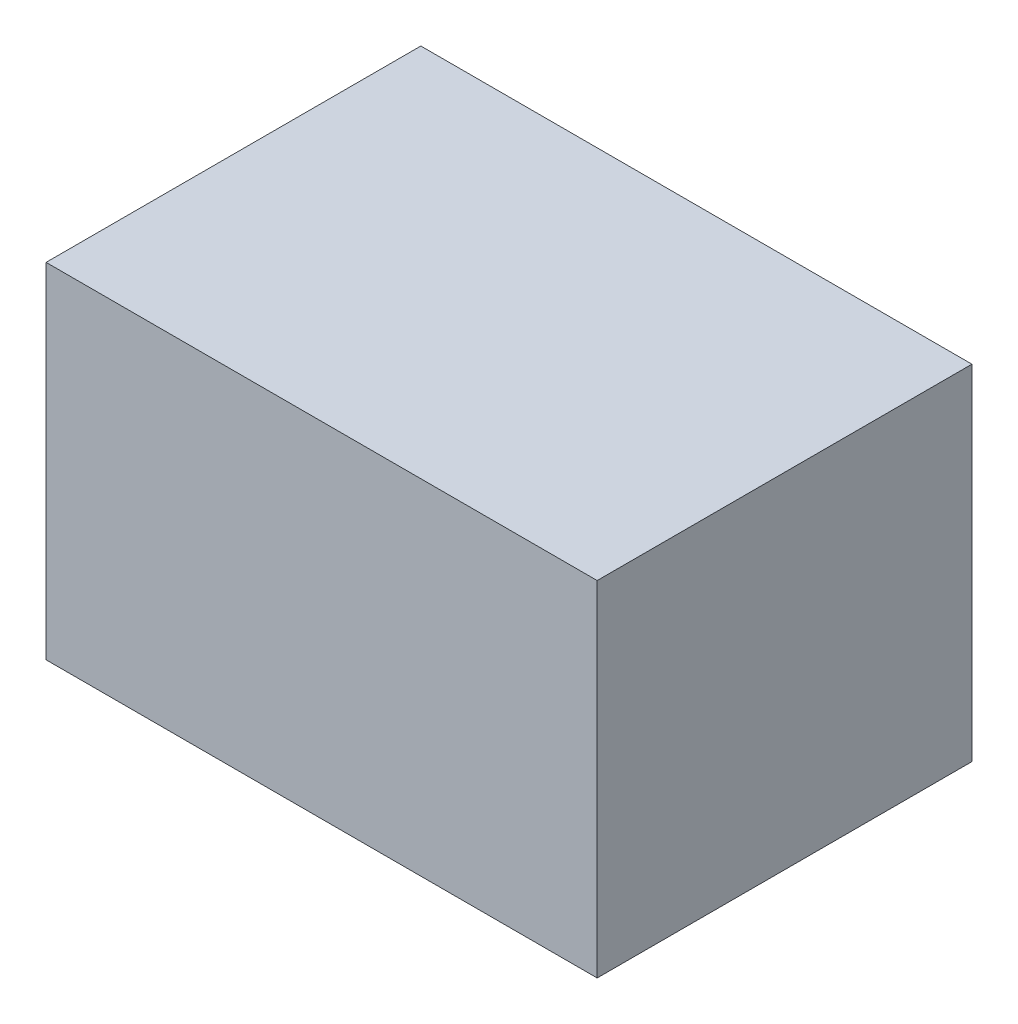
ISO-10303-21;
HEADER;
FILE_DESCRIPTION(('STEP AP214'),'2;1');
FILE_NAME('part.step','',(''),(''),'','','');
FILE_SCHEMA(('AUTOMOTIVE_DESIGN { 1 0 10303 214 1 1 1 1 }'));
ENDSEC;
DATA;
#1=APPLICATION_CONTEXT('core data for automotive mechanical design processes');
#2=APPLICATION_PROTOCOL_DEFINITION('international standard','automotive_design',2000,#1);
#3=PRODUCT_CONTEXT('',#1,'mechanical');
#4=PRODUCT('Part','Part','',(#3));
#5=PRODUCT_RELATED_PRODUCT_CATEGORY('part','',(#4));
#6=PRODUCT_DEFINITION_FORMATION('','',#4);
#7=PRODUCT_DEFINITION_CONTEXT('part definition',#1,'design');
#8=PRODUCT_DEFINITION('design','',#6,#7);
#9=PRODUCT_DEFINITION_SHAPE('','',#8);
#10=(LENGTH_UNIT() NAMED_UNIT(*) SI_UNIT(.MILLI.,.METRE.));
#11=(NAMED_UNIT(*) PLANE_ANGLE_UNIT() SI_UNIT($,.RADIAN.));
#12=(NAMED_UNIT(*) SI_UNIT($,.STERADIAN.) SOLID_ANGLE_UNIT());
#13=UNCERTAINTY_MEASURE_WITH_UNIT(LENGTH_MEASURE(1.E-05),#10,'distance_accuracy_value','');
#14=(GEOMETRIC_REPRESENTATION_CONTEXT(3) GLOBAL_UNCERTAINTY_ASSIGNED_CONTEXT((#13)) GLOBAL_UNIT_ASSIGNED_CONTEXT((#10,
#11,#12)) REPRESENTATION_CONTEXT('',''));
#15=CARTESIAN_POINT('',(0.,0.,0.));
#16=DIRECTION('',(0.,0.,1.));
#17=DIRECTION('',(1.,0.,0.));
#18=AXIS2_PLACEMENT_3D('',#15,#16,#17);
#19=CARTESIAN_POINT('',(0.,0.,561.34));
#20=DIRECTION('',(1.,0.,0.));
#21=DIRECTION('',(0.,0.,-1.));
#22=AXIS2_PLACEMENT_3D('',#19,#20,#21);
#23=PLANE('',#22);
#24=DIRECTION('',(0.,-1.,0.));
#25=VECTOR('',#24,1.);
#26=CARTESIAN_POINT('',(0.,0.,0.));
#27=LINE('',#26,#25);
#28=CARTESIAN_POINT('',(0.,515.62,0.));
#29=VERTEX_POINT('',#28);
#30=CARTESIAN_POINT('',(0.,0.,0.));
#31=VERTEX_POINT('',#30);
#32=EDGE_CURVE('E163',#29,#31,#27,.T.);
#33=ORIENTED_EDGE('',*,*,#32,.T.);
#34=DIRECTION('',(0.,0.,-1.));
#35=VECTOR('',#34,1.);
#36=CARTESIAN_POINT('',(0.,0.,561.34));
#37=LINE('',#36,#35);
#38=CARTESIAN_POINT('',(0.,0.,561.34));
#39=VERTEX_POINT('',#38);
#40=EDGE_CURVE('E11',#39,#31,#37,.T.);
#41=ORIENTED_EDGE('',*,*,#40,.F.);
#42=DIRECTION('',(0.,-1.,0.));
#43=VECTOR('',#42,1.);
#44=CARTESIAN_POINT('',(0.,0.,561.34));
#45=LINE('',#44,#43);
#46=CARTESIAN_POINT('',(0.,515.62,561.34));
#47=VERTEX_POINT('',#46);
#48=EDGE_CURVE('E169',#47,#39,#45,.T.);
#49=ORIENTED_EDGE('',*,*,#48,.F.);
#50=DIRECTION('',(0.,0.,-1.));
#51=VECTOR('',#50,1.);
#52=CARTESIAN_POINT('',(0.,515.62,561.34));
#53=LINE('',#52,#51);
#54=EDGE_CURVE('E179',#47,#29,#53,.T.);
#55=ORIENTED_EDGE('',*,*,#54,.T.);
#56=EDGE_LOOP('',(#33,#41,#49,#55));
#57=FACE_BOUND('',#56,.T.);
#58=ADVANCED_FACE('F44',(#57),#23,.F.);
#59=CARTESIAN_POINT('',(0.,0.,561.34));
#60=DIRECTION('',(0.,1.,0.));
#61=DIRECTION('',(0.,0.,1.));
#62=AXIS2_PLACEMENT_3D('',#59,#60,#61);
#63=PLANE('',#62);
#64=DIRECTION('',(1.,0.,0.));
#65=VECTOR('',#64,1.);
#66=CARTESIAN_POINT('',(0.,0.,0.));
#67=LINE('',#66,#65);
#68=CARTESIAN_POINT('',(825.5,0.,0.));
#69=VERTEX_POINT('',#68);
#70=EDGE_CURVE('E183',#31,#69,#67,.T.);
#71=ORIENTED_EDGE('',*,*,#70,.T.);
#72=DIRECTION('',(0.,0.,-1.));
#73=VECTOR('',#72,1.);
#74=CARTESIAN_POINT('',(825.5,0.,561.34));
#75=LINE('',#74,#73);
#76=CARTESIAN_POINT('',(825.5,0.,561.34));
#77=VERTEX_POINT('',#76);
#78=EDGE_CURVE('E52',#77,#69,#75,.T.);
#79=ORIENTED_EDGE('',*,*,#78,.F.);
#80=DIRECTION('',(1.,0.,0.));
#81=VECTOR('',#80,1.);
#82=CARTESIAN_POINT('',(0.,0.,561.34));
#83=LINE('',#82,#81);
#84=EDGE_CURVE('E96',#39,#77,#83,.T.);
#85=ORIENTED_EDGE('',*,*,#84,.F.);
#86=ORIENTED_EDGE('',*,*,#40,.T.);
#87=EDGE_LOOP('',(#71,#79,#85,#86));
#88=FACE_BOUND('',#87,.T.);
#89=ADVANCED_FACE('F217',(#88),#63,.F.);
#90=CARTESIAN_POINT('',(825.5,0.,561.34));
#91=DIRECTION('',(-1.,0.,0.));
#92=DIRECTION('',(0.,0.,1.));
#93=AXIS2_PLACEMENT_3D('',#90,#91,#92);
#94=PLANE('',#93);
#95=DIRECTION('',(0.,1.,0.));
#96=VECTOR('',#95,1.);
#97=CARTESIAN_POINT('',(825.5,0.,0.));
#98=LINE('',#97,#96);
#99=CARTESIAN_POINT('',(825.5,515.62,0.));
#100=VERTEX_POINT('',#99);
#101=EDGE_CURVE('E186',#69,#100,#98,.T.);
#102=ORIENTED_EDGE('',*,*,#101,.T.);
#103=DIRECTION('',(0.,0.,-1.));
#104=VECTOR('',#103,1.);
#105=CARTESIAN_POINT('',(825.5,515.62,561.34));
#106=LINE('',#105,#104);
#107=CARTESIAN_POINT('',(825.5,515.62,561.34));
#108=VERTEX_POINT('',#107);
#109=EDGE_CURVE('E193',#108,#100,#106,.T.);
#110=ORIENTED_EDGE('',*,*,#109,.F.);
#111=DIRECTION('',(0.,1.,0.));
#112=VECTOR('',#111,1.);
#113=CARTESIAN_POINT('',(825.5,0.,561.34));
#114=LINE('',#113,#112);
#115=EDGE_CURVE('E174',#77,#108,#114,.T.);
#116=ORIENTED_EDGE('',*,*,#115,.F.);
#117=ORIENTED_EDGE('',*,*,#78,.T.);
#118=EDGE_LOOP('',(#102,#110,#116,#117));
#119=FACE_BOUND('',#118,.T.);
#120=ADVANCED_FACE('F200',(#119),#94,.F.);
#121=CARTESIAN_POINT('',(0.,515.62,561.34));
#122=DIRECTION('',(0.,-1.,0.));
#123=DIRECTION('',(0.,0.,-1.));
#124=AXIS2_PLACEMENT_3D('',#121,#122,#123);
#125=PLANE('',#124);
#126=DIRECTION('',(-1.,0.,0.));
#127=VECTOR('',#126,1.);
#128=CARTESIAN_POINT('',(0.,515.62,0.));
#129=LINE('',#128,#127);
#130=EDGE_CURVE('E89',#100,#29,#129,.T.);
#131=ORIENTED_EDGE('',*,*,#130,.T.);
#132=ORIENTED_EDGE('',*,*,#54,.F.);
#133=DIRECTION('',(-1.,0.,0.));
#134=VECTOR('',#133,1.);
#135=CARTESIAN_POINT('',(0.,515.62,561.34));
#136=LINE('',#135,#134);
#137=EDGE_CURVE('E68',#108,#47,#136,.T.);
#138=ORIENTED_EDGE('',*,*,#137,.F.);
#139=ORIENTED_EDGE('',*,*,#109,.T.);
#140=EDGE_LOOP('',(#131,#132,#138,#139));
#141=FACE_BOUND('',#140,.T.);
#142=ADVANCED_FACE('F208',(#141),#125,.F.);
#143=CARTESIAN_POINT('',(0.,0.,561.34));
#144=DIRECTION('',(0.,0.,-1.));
#145=DIRECTION('',(-1.,0.,0.));
#146=AXIS2_PLACEMENT_3D('',#143,#144,#145);
#147=PLANE('',#146);
#148=ORIENTED_EDGE('',*,*,#48,.T.);
#149=ORIENTED_EDGE('',*,*,#84,.T.);
#150=ORIENTED_EDGE('',*,*,#115,.T.);
#151=ORIENTED_EDGE('',*,*,#137,.T.);
#152=EDGE_LOOP('',(#148,#149,#150,#151));
#153=FACE_BOUND('',#152,.T.);
#154=ADVANCED_FACE('F210',(#153),#147,.F.);
#155=CARTESIAN_POINT('',(0.,0.,0.));
#156=DIRECTION('',(0.,0.,-1.));
#157=DIRECTION('',(-1.,0.,0.));
#158=AXIS2_PLACEMENT_3D('',#155,#156,#157);
#159=PLANE('',#158);
#160=DIRECTION('',(0.,-1.,0.));
#161=VECTOR('',#160,1.);
#162=CARTESIAN_POINT('',(812.8,12.7,0.));
#163=LINE('',#162,#161);
#164=CARTESIAN_POINT('',(812.8,502.92,0.));
#165=VERTEX_POINT('',#164);
#166=CARTESIAN_POINT('',(812.8,12.7,0.));
#167=VERTEX_POINT('',#166);
#168=EDGE_CURVE('E59',#165,#167,#163,.T.);
#169=ORIENTED_EDGE('',*,*,#168,.F.);
#170=DIRECTION('',(1.,0.,0.));
#171=VECTOR('',#170,1.);
#172=CARTESIAN_POINT('',(812.8,502.92,0.));
#173=LINE('',#172,#171);
#174=CARTESIAN_POINT('',(12.7,502.92,0.));
#175=VERTEX_POINT('',#174);
#176=EDGE_CURVE('E141',#175,#165,#173,.T.);
#177=ORIENTED_EDGE('',*,*,#176,.F.);
#178=DIRECTION('',(0.,1.,0.));
#179=VECTOR('',#178,1.);
#180=CARTESIAN_POINT('',(12.7,12.7,0.));
#181=LINE('',#180,#179);
#182=CARTESIAN_POINT('',(12.7,12.7,0.));
#183=VERTEX_POINT('',#182);
#184=EDGE_CURVE('E145',#183,#175,#181,.T.);
#185=ORIENTED_EDGE('',*,*,#184,.F.);
#186=DIRECTION('',(-1.,0.,0.));
#187=VECTOR('',#186,1.);
#188=CARTESIAN_POINT('',(812.8,12.7,0.));
#189=LINE('',#188,#187);
#190=EDGE_CURVE('E154',#167,#183,#189,.T.);
#191=ORIENTED_EDGE('',*,*,#190,.F.);
#192=EDGE_LOOP('',(#169,#177,#185,#191));
#193=FACE_BOUND('',#192,.T.);
#194=ORIENTED_EDGE('',*,*,#32,.F.);
#195=ORIENTED_EDGE('',*,*,#130,.F.);
#196=ORIENTED_EDGE('',*,*,#101,.F.);
#197=ORIENTED_EDGE('',*,*,#70,.F.);
#198=EDGE_LOOP('',(#194,#195,#196,#197));
#199=FACE_BOUND('',#198,.T.);
#200=ADVANCED_FACE('F204',(#193,#199),#159,.T.);
#201=CARTESIAN_POINT('',(812.8,12.7,535.94));
#202=DIRECTION('',(1.,0.,0.));
#203=DIRECTION('',(0.,0.,-1.));
#204=AXIS2_PLACEMENT_3D('',#201,#202,#203);
#205=PLANE('',#204);
#206=ORIENTED_EDGE('',*,*,#168,.T.);
#207=DIRECTION('',(0.,0.,-1.));
#208=VECTOR('',#207,1.);
#209=CARTESIAN_POINT('',(812.8,12.7,535.94));
#210=LINE('',#209,#208);
#211=CARTESIAN_POINT('',(812.8,12.7,535.94));
#212=VERTEX_POINT('',#211);
#213=EDGE_CURVE('E116',#212,#167,#210,.T.);
#214=ORIENTED_EDGE('',*,*,#213,.F.);
#215=DIRECTION('',(0.,-1.,0.));
#216=VECTOR('',#215,1.);
#217=CARTESIAN_POINT('',(812.8,12.7,535.94));
#218=LINE('',#217,#216);
#219=CARTESIAN_POINT('',(812.8,502.92,535.94));
#220=VERTEX_POINT('',#219);
#221=EDGE_CURVE('E120',#220,#212,#218,.T.);
#222=ORIENTED_EDGE('',*,*,#221,.F.);
#223=DIRECTION('',(0.,0.,-1.));
#224=VECTOR('',#223,1.);
#225=CARTESIAN_POINT('',(812.8,502.92,535.94));
#226=LINE('',#225,#224);
#227=EDGE_CURVE('E160',#220,#165,#226,.T.);
#228=ORIENTED_EDGE('',*,*,#227,.T.);
#229=EDGE_LOOP('',(#206,#214,#222,#228));
#230=FACE_BOUND('',#229,.T.);
#231=ADVANCED_FACE('F118',(#230),#205,.F.);
#232=CARTESIAN_POINT('',(812.8,502.92,535.94));
#233=DIRECTION('',(0.,1.,0.));
#234=DIRECTION('',(0.,0.,1.));
#235=AXIS2_PLACEMENT_3D('',#232,#233,#234);
#236=PLANE('',#235);
#237=ORIENTED_EDGE('',*,*,#176,.T.);
#238=ORIENTED_EDGE('',*,*,#227,.F.);
#239=DIRECTION('',(1.,0.,0.));
#240=VECTOR('',#239,1.);
#241=CARTESIAN_POINT('',(812.8,502.92,535.94));
#242=LINE('',#241,#240);
#243=CARTESIAN_POINT('',(12.7,502.92,535.94));
#244=VERTEX_POINT('',#243);
#245=EDGE_CURVE('E127',#244,#220,#242,.T.);
#246=ORIENTED_EDGE('',*,*,#245,.F.);
#247=DIRECTION('',(0.,0.,-1.));
#248=VECTOR('',#247,1.);
#249=CARTESIAN_POINT('',(12.7,502.92,535.94));
#250=LINE('',#249,#248);
#251=EDGE_CURVE('E164',#244,#175,#250,.T.);
#252=ORIENTED_EDGE('',*,*,#251,.T.);
#253=EDGE_LOOP('',(#237,#238,#246,#252));
#254=FACE_BOUND('',#253,.T.);
#255=ADVANCED_FACE('F259',(#254),#236,.F.);
#256=CARTESIAN_POINT('',(12.7,12.7,535.94));
#257=DIRECTION('',(-1.,0.,0.));
#258=DIRECTION('',(0.,0.,1.));
#259=AXIS2_PLACEMENT_3D('',#256,#257,#258);
#260=PLANE('',#259);
#261=ORIENTED_EDGE('',*,*,#184,.T.);
#262=ORIENTED_EDGE('',*,*,#251,.F.);
#263=DIRECTION('',(0.,1.,0.));
#264=VECTOR('',#263,1.);
#265=CARTESIAN_POINT('',(12.7,12.7,535.94));
#266=LINE('',#265,#264);
#267=CARTESIAN_POINT('',(12.7,12.7,535.94));
#268=VERTEX_POINT('',#267);
#269=EDGE_CURVE('E136',#268,#244,#266,.T.);
#270=ORIENTED_EDGE('',*,*,#269,.F.);
#271=DIRECTION('',(0.,0.,-1.));
#272=VECTOR('',#271,1.);
#273=CARTESIAN_POINT('',(12.7,12.7,535.94));
#274=LINE('',#273,#272);
#275=EDGE_CURVE('E126',#268,#183,#274,.T.);
#276=ORIENTED_EDGE('',*,*,#275,.T.);
#277=EDGE_LOOP('',(#261,#262,#270,#276));
#278=FACE_BOUND('',#277,.T.);
#279=ADVANCED_FACE('F268',(#278),#260,.F.);
#280=CARTESIAN_POINT('',(812.8,12.7,535.94));
#281=DIRECTION('',(0.,-1.,0.));
#282=DIRECTION('',(0.,0.,-1.));
#283=AXIS2_PLACEMENT_3D('',#280,#281,#282);
#284=PLANE('',#283);
#285=ORIENTED_EDGE('',*,*,#190,.T.);
#286=ORIENTED_EDGE('',*,*,#275,.F.);
#287=DIRECTION('',(-1.,0.,0.));
#288=VECTOR('',#287,1.);
#289=CARTESIAN_POINT('',(812.8,12.7,535.94));
#290=LINE('',#289,#288);
#291=EDGE_CURVE('E130',#212,#268,#290,.T.);
#292=ORIENTED_EDGE('',*,*,#291,.F.);
#293=ORIENTED_EDGE('',*,*,#213,.T.);
#294=EDGE_LOOP('',(#285,#286,#292,#293));
#295=FACE_BOUND('',#294,.T.);
#296=ADVANCED_FACE('F131',(#295),#284,.F.);
#297=CARTESIAN_POINT('',(0.,0.,535.94));
#298=DIRECTION('',(0.,0.,1.));
#299=DIRECTION('',(1.,0.,0.));
#300=AXIS2_PLACEMENT_3D('',#297,#298,#299);
#301=PLANE('',#300);
#302=ORIENTED_EDGE('',*,*,#221,.T.);
#303=ORIENTED_EDGE('',*,*,#291,.T.);
#304=ORIENTED_EDGE('',*,*,#269,.T.);
#305=ORIENTED_EDGE('',*,*,#245,.T.);
#306=EDGE_LOOP('',(#302,#303,#304,#305));
#307=FACE_BOUND('',#306,.T.);
#308=ADVANCED_FACE('F138',(#307),#301,.F.);
#309=CLOSED_SHELL('',(#58,#89,#120,#142,#154,#200,#231,#255,#279,#296,#308));
#310=MANIFOLD_SOLID_BREP('B2',#309);
#311=ADVANCED_BREP_SHAPE_REPRESENTATION('',(#18,#310),#14);
#312=SHAPE_DEFINITION_REPRESENTATION(#9,#311);
ENDSEC;
END-ISO-10303-21;
